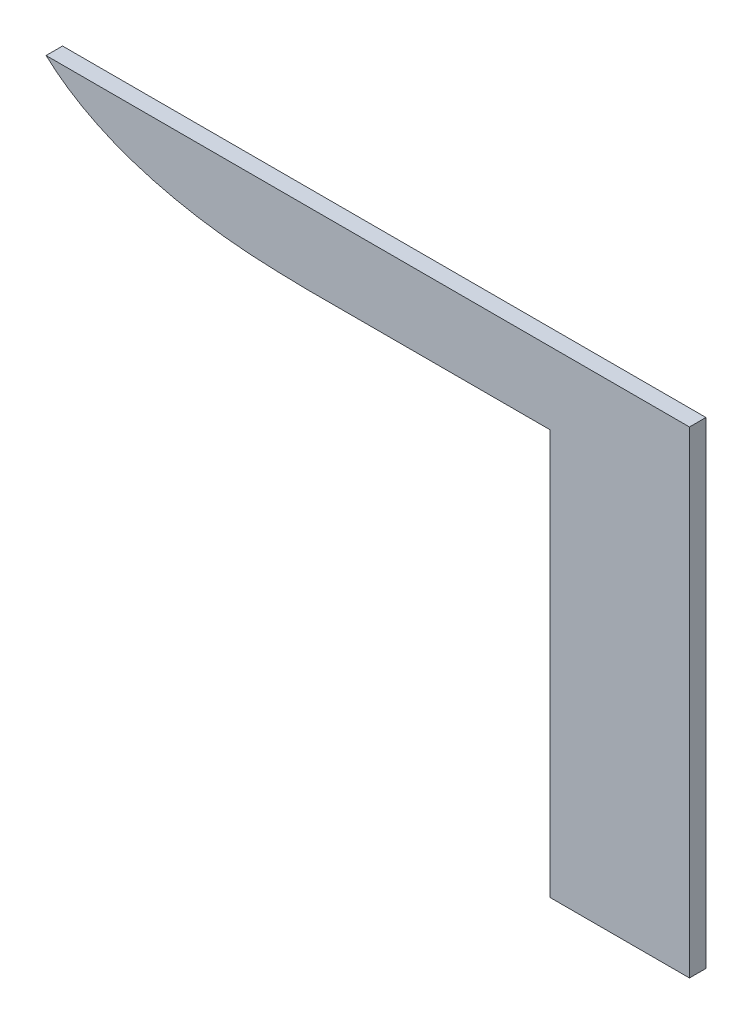
ISO-10303-21;
HEADER;
FILE_DESCRIPTION(('STEP AP214'),'2;1');
FILE_NAME('part.step','',(''),(''),'','','');
FILE_SCHEMA(('AUTOMOTIVE_DESIGN { 1 0 10303 214 1 1 1 1 }'));
ENDSEC;
DATA;
#1=APPLICATION_CONTEXT('core data for automotive mechanical design processes');
#2=APPLICATION_PROTOCOL_DEFINITION('international standard','automotive_design',2000,#1);
#3=PRODUCT_CONTEXT('',#1,'mechanical');
#4=PRODUCT('Part','Part','',(#3));
#5=PRODUCT_RELATED_PRODUCT_CATEGORY('part','',(#4));
#6=PRODUCT_DEFINITION_FORMATION('','',#4);
#7=PRODUCT_DEFINITION_CONTEXT('part definition',#1,'design');
#8=PRODUCT_DEFINITION('design','',#6,#7);
#9=PRODUCT_DEFINITION_SHAPE('','',#8);
#10=(LENGTH_UNIT() NAMED_UNIT(*) SI_UNIT(.MILLI.,.METRE.));
#11=(NAMED_UNIT(*) PLANE_ANGLE_UNIT() SI_UNIT($,.RADIAN.));
#12=(NAMED_UNIT(*) SI_UNIT($,.STERADIAN.) SOLID_ANGLE_UNIT());
#13=UNCERTAINTY_MEASURE_WITH_UNIT(LENGTH_MEASURE(1.E-05),#10,'distance_accuracy_value','');
#14=(GEOMETRIC_REPRESENTATION_CONTEXT(3) GLOBAL_UNCERTAINTY_ASSIGNED_CONTEXT((#13)) GLOBAL_UNIT_ASSIGNED_CONTEXT((#10,
#11,#12)) REPRESENTATION_CONTEXT('',''));
#15=CARTESIAN_POINT('',(0.,0.,0.));
#16=DIRECTION('',(0.,0.,1.));
#17=DIRECTION('',(1.,0.,0.));
#18=AXIS2_PLACEMENT_3D('',#15,#16,#17);
#19=CARTESIAN_POINT('',(6.15384615384617,-15.,0.5));
#20=DIRECTION('',(0.,1.,0.));
#21=DIRECTION('',(0.,0.,1.));
#22=AXIS2_PLACEMENT_3D('',#19,#20,#21);
#23=PLANE('',#22);
#24=DIRECTION('',(1.,0.,0.));
#25=VECTOR('',#24,1.);
#26=CARTESIAN_POINT('',(6.15384615384617,-15.,0.));
#27=LINE('',#26,#25);
#28=CARTESIAN_POINT('',(6.15384615384617,-15.,0.));
#29=VERTEX_POINT('',#28);
#30=CARTESIAN_POINT('',(10.3846153846154,-15.,0.));
#31=VERTEX_POINT('',#30);
#32=EDGE_CURVE('E95',#29,#31,#27,.T.);
#33=ORIENTED_EDGE('',*,*,#32,.T.);
#34=DIRECTION('',(0.,0.,-1.));
#35=VECTOR('',#34,1.);
#36=CARTESIAN_POINT('',(10.3846153846154,-15.,0.5));
#37=LINE('',#36,#35);
#38=CARTESIAN_POINT('',(10.3846153846154,-15.,0.5));
#39=VERTEX_POINT('',#38);
#40=EDGE_CURVE('E48',#39,#31,#37,.T.);
#41=ORIENTED_EDGE('',*,*,#40,.F.);
#42=DIRECTION('',(1.,0.,0.));
#43=VECTOR('',#42,1.);
#44=CARTESIAN_POINT('',(6.15384615384617,-15.,0.5));
#45=LINE('',#44,#43);
#46=CARTESIAN_POINT('',(6.15384615384617,-15.,0.5));
#47=VERTEX_POINT('',#46);
#48=EDGE_CURVE('E131',#47,#39,#45,.T.);
#49=ORIENTED_EDGE('',*,*,#48,.F.);
#50=DIRECTION('',(0.,0.,-1.));
#51=VECTOR('',#50,1.);
#52=CARTESIAN_POINT('',(6.15384615384617,-15.,0.5));
#53=LINE('',#52,#51);
#54=EDGE_CURVE('E130',#47,#29,#53,.T.);
#55=ORIENTED_EDGE('',*,*,#54,.T.);
#56=EDGE_LOOP('',(#33,#41,#49,#55));
#57=FACE_BOUND('',#56,.T.);
#58=ADVANCED_FACE('F39',(#57),#23,.F.);
#59=CARTESIAN_POINT('',(6.15384615384617,-2.69230769230769,0.5));
#60=DIRECTION('',(1.,0.,0.));
#61=DIRECTION('',(0.,0.,-1.));
#62=AXIS2_PLACEMENT_3D('',#59,#60,#61);
#63=PLANE('',#62);
#64=DIRECTION('',(0.,-1.,0.));
#65=VECTOR('',#64,1.);
#66=CARTESIAN_POINT('',(6.15384615384617,-2.69230769230769,0.));
#67=LINE('',#66,#65);
#68=CARTESIAN_POINT('',(6.15384615384617,-2.69230769230769,0.));
#69=VERTEX_POINT('',#68);
#70=EDGE_CURVE('E127',#69,#29,#67,.T.);
#71=ORIENTED_EDGE('',*,*,#70,.T.);
#72=ORIENTED_EDGE('',*,*,#54,.F.);
#73=DIRECTION('',(0.,-1.,0.));
#74=VECTOR('',#73,1.);
#75=CARTESIAN_POINT('',(6.15384615384617,-2.69230769230769,0.5));
#76=LINE('',#75,#74);
#77=CARTESIAN_POINT('',(6.15384615384617,-2.69230769230769,0.5));
#78=VERTEX_POINT('',#77);
#79=EDGE_CURVE('E129',#78,#47,#76,.T.);
#80=ORIENTED_EDGE('',*,*,#79,.F.);
#81=DIRECTION('',(0.,0.,-1.));
#82=VECTOR('',#81,1.);
#83=CARTESIAN_POINT('',(6.15384615384617,-2.69230769230769,0.5));
#84=LINE('',#83,#82);
#85=EDGE_CURVE('E125',#78,#69,#84,.T.);
#86=ORIENTED_EDGE('',*,*,#85,.T.);
#87=EDGE_LOOP('',(#71,#72,#80,#86));
#88=FACE_BOUND('',#87,.T.);
#89=ADVANCED_FACE('F143',(#88),#63,.F.);
#90=CARTESIAN_POINT('',(-1.19591346153845,-2.69230769230769,0.5));
#91=DIRECTION('',(0.,1.,0.));
#92=DIRECTION('',(0.,0.,1.));
#93=AXIS2_PLACEMENT_3D('',#90,#91,#92);
#94=PLANE('',#93);
#95=DIRECTION('',(1.,0.,0.));
#96=VECTOR('',#95,1.);
#97=CARTESIAN_POINT('',(-1.19591346153845,-2.69230769230769,0.));
#98=LINE('',#97,#96);
#99=CARTESIAN_POINT('',(-1.19591346153845,-2.69230769230769,0.));
#100=VERTEX_POINT('',#99);
#101=EDGE_CURVE('E107',#100,#69,#98,.T.);
#102=ORIENTED_EDGE('',*,*,#101,.T.);
#103=ORIENTED_EDGE('',*,*,#85,.F.);
#104=DIRECTION('',(1.,0.,0.));
#105=VECTOR('',#104,1.);
#106=CARTESIAN_POINT('',(-1.19591346153845,-2.69230769230769,0.5));
#107=LINE('',#106,#105);
#108=CARTESIAN_POINT('',(-1.19591346153845,-2.69230769230769,0.5));
#109=VERTEX_POINT('',#108);
#110=EDGE_CURVE('E146',#109,#78,#107,.T.);
#111=ORIENTED_EDGE('',*,*,#110,.F.);
#112=DIRECTION('',(0.,0.,-1.));
#113=VECTOR('',#112,1.);
#114=CARTESIAN_POINT('',(-1.19591346153845,-2.69230769230769,0.5));
#115=LINE('',#114,#113);
#116=EDGE_CURVE('E123',#109,#100,#115,.T.);
#117=ORIENTED_EDGE('',*,*,#116,.T.);
#118=EDGE_LOOP('',(#102,#103,#111,#117));
#119=FACE_BOUND('',#118,.T.);
#120=ADVANCED_FACE('F139',(#119),#94,.F.);
#121=CARTESIAN_POINT('',(-2.86670923646913,14.9469507429344,0.5));
#122=DIRECTION('',(0.,0.,-1.));
#123=DIRECTION('',(-1.,0.,0.));
#124=AXIS2_PLACEMENT_3D('',#121,#122,#123);
#125=PLANE('',#124);
#126=DIRECTION('',(0.,1.,0.));
#127=VECTOR('',#126,1.);
#128=CARTESIAN_POINT('',(10.3846153846154,-15.,0.5));
#129=LINE('',#128,#127);
#130=CARTESIAN_POINT('',(10.3846153846154,-0.5,0.5));
#131=VERTEX_POINT('',#130);
#132=EDGE_CURVE('E136',#39,#131,#129,.T.);
#133=ORIENTED_EDGE('',*,*,#132,.T.);
#134=DIRECTION('',(-1.,0.,0.));
#135=VECTOR('',#134,1.);
#136=CARTESIAN_POINT('',(-2.86670923646913,-0.5,0.5));
#137=LINE('',#136,#135);
#138=CARTESIAN_POINT('',(-9.16442769140376,-0.500000000014972,0.5));
#139=VERTEX_POINT('',#138);
#140=EDGE_CURVE('E88',#131,#139,#137,.T.);
#141=ORIENTED_EDGE('',*,*,#140,.T.);
#142=CARTESIAN_POINT('',(-11.9230769230769,6.37620192307692,0.5));
#143=CARTESIAN_POINT('',(-11.9164523883656,6.06536319775668,0.5));
#144=CARTESIAN_POINT('',(-11.9034182534223,5.45377097762736,0.5));
#145=CARTESIAN_POINT('',(-11.7914962037805,4.55525374172224,0.5));
#146=CARTESIAN_POINT('',(-11.6149709347498,3.69084362808375,0.5));
#147=CARTESIAN_POINT('',(-11.3516595574946,2.86645592929951,0.5));
#148=CARTESIAN_POINT('',(-11.0297543254307,2.07245274326711,0.5));
#149=CARTESIAN_POINT('',(-10.624079350204,1.32222512292036,0.5));
#150=CARTESIAN_POINT('',(-10.1503654357704,0.605585610203963,0.5));
#151=CARTESIAN_POINT('',(-9.60686856623352,-0.0755157562340138,0.5));
#152=CARTESIAN_POINT('',(-8.96702180481229,-0.707257877884189,0.5));
#153=CARTESIAN_POINT('',(-8.19720749218899,-1.24316686773636,0.5));
#154=CARTESIAN_POINT('',(-7.3122677220458,-1.69317977262245,0.5));
#155=CARTESIAN_POINT('',(-6.31199609916221,-2.05678533275972,0.5));
#156=CARTESIAN_POINT('',(-5.19882080470571,-2.34288431635212,0.5));
#157=CARTESIAN_POINT('',(-3.96909448292088,-2.55250497248433,0.5));
#158=CARTESIAN_POINT('',(-2.62042159325954,-2.66823301951604,0.5));
#159=CARTESIAN_POINT('',(-1.68290914412343,-2.68407729934039,0.5));
#160=CARTESIAN_POINT('',(-1.19591346153845,-2.69230769230769,0.5));
#161=B_SPLINE_CURVE_WITH_KNOTS('',3,(#142,#143,#144,#145,#146,#147,#148,#149,#150,#151,#152,
#153,#154,#155,#156,#157,#158,#159,#160),.UNSPECIFIED.,.F.,.F.,(4,1,1,1,1,1,1,1,1,1,1,1,1,1,1,1,
4),(0.,0.0580480686591468,0.114212755019154,0.168891647175276,0.222626270124239,
0.275651229891811,0.328725027145903,0.381658791237261,0.43595343503421,0.491263855848966,
0.548992591180569,0.610416548658029,0.676247964980973,0.747409474018392,0.824866485744554,
0.909025991711439,1.),.UNSPECIFIED.);
#162=EDGE_CURVE('E148',#139,#109,#161,.T.);
#163=ORIENTED_EDGE('',*,*,#162,.T.);
#164=ORIENTED_EDGE('',*,*,#110,.T.);
#165=ORIENTED_EDGE('',*,*,#79,.T.);
#166=ORIENTED_EDGE('',*,*,#48,.T.);
#167=EDGE_LOOP('',(#133,#141,#163,#164,#165,#166));
#168=FACE_BOUND('',#167,.T.);
#169=ADVANCED_FACE('F149',(#168),#125,.F.);
#170=DIRECTION('',(0.,0.,-1.));
#171=VECTOR('',#170,1.);
#172=SURFACE_OF_LINEAR_EXTRUSION('',#161,#171);
#173=ORIENTED_EDGE('',*,*,#162,.F.);
#174=DIRECTION('',(0.,0.,-1.));
#175=VECTOR('',#174,1.);
#176=CARTESIAN_POINT('',(-9.16442769142002,-0.5,0.5));
#177=LINE('',#176,#175);
#178=CARTESIAN_POINT('',(-9.16432715507257,-0.5,-1.2E-05));
#179=VERTEX_POINT('',#178);
#180=EDGE_CURVE('E53',#139,#179,#177,.T.);
#181=ORIENTED_EDGE('',*,*,#180,.T.);
#182=CARTESIAN_POINT('',(-11.9230769230769,6.37620192307692,0.));
#183=CARTESIAN_POINT('',(-11.9164523883656,6.06536319775668,0.));
#184=CARTESIAN_POINT('',(-11.9034182534223,5.45377097762736,0.));
#185=CARTESIAN_POINT('',(-11.7914962037805,4.55525374172224,0.));
#186=CARTESIAN_POINT('',(-11.6149709347498,3.69084362808375,0.));
#187=CARTESIAN_POINT('',(-11.3516595574946,2.86645592929951,0.));
#188=CARTESIAN_POINT('',(-11.0297543254307,2.07245274326711,0.));
#189=CARTESIAN_POINT('',(-10.624079350204,1.32222512292036,0.));
#190=CARTESIAN_POINT('',(-10.1503654357704,0.605585610203963,0.));
#191=CARTESIAN_POINT('',(-9.60686856623352,-0.0755157562340138,0.));
#192=CARTESIAN_POINT('',(-8.96702180481229,-0.707257877884189,0.));
#193=CARTESIAN_POINT('',(-8.19720749218899,-1.24316686773636,0.));
#194=CARTESIAN_POINT('',(-7.3122677220458,-1.69317977262245,0.));
#195=CARTESIAN_POINT('',(-6.31199609916221,-2.05678533275972,0.));
#196=CARTESIAN_POINT('',(-5.19882080470571,-2.34288431635212,0.));
#197=CARTESIAN_POINT('',(-3.96909448292088,-2.55250497248433,0.));
#198=CARTESIAN_POINT('',(-2.62042159325954,-2.66823301951604,0.));
#199=CARTESIAN_POINT('',(-1.68290914412343,-2.68407729934039,0.));
#200=CARTESIAN_POINT('',(-1.19591346153845,-2.69230769230769,0.));
#201=B_SPLINE_CURVE_WITH_KNOTS('',3,(#182,#183,#184,#185,#186,#187,#188,#189,#190,#191,#192,
#193,#194,#195,#196,#197,#198,#199,#200),.UNSPECIFIED.,.F.,.F.,(4,1,1,1,1,1,1,1,1,1,1,1,1,1,1,1,
4),(0.,0.0580480686591468,0.114212755019154,0.168891647175276,0.222626270124239,
0.275651229891811,0.328725027145903,0.381658791237261,0.43595343503421,0.491263855848966,
0.548992591180569,0.610416548658029,0.676247964980973,0.747409474018392,0.824866485744554,
0.909025991711439,1.),.UNSPECIFIED.);
#202=EDGE_CURVE('E102',#179,#100,#201,.T.);
#203=ORIENTED_EDGE('',*,*,#202,.T.);
#204=ORIENTED_EDGE('',*,*,#116,.F.);
#205=EDGE_LOOP('',(#173,#181,#203,#204));
#206=FACE_BOUND('',#205,.T.);
#207=ADVANCED_FACE('F162',(#206),#172,.F.);
#208=CARTESIAN_POINT('',(10.3846153846154,-15.,0.5));
#209=DIRECTION('',(-1.,0.,0.));
#210=DIRECTION('',(0.,0.,1.));
#211=AXIS2_PLACEMENT_3D('',#208,#209,#210);
#212=PLANE('',#211);
#213=DIRECTION('',(0.,1.,0.));
#214=VECTOR('',#213,1.);
#215=CARTESIAN_POINT('',(10.3846153846154,-15.,0.));
#216=LINE('',#215,#214);
#217=CARTESIAN_POINT('',(10.3846153846154,-0.5,0.));
#218=VERTEX_POINT('',#217);
#219=EDGE_CURVE('E97',#31,#218,#216,.T.);
#220=ORIENTED_EDGE('',*,*,#219,.T.);
#221=DIRECTION('',(0.,0.,1.));
#222=VECTOR('',#221,1.);
#223=CARTESIAN_POINT('',(10.3846153846154,-0.5,0.5));
#224=LINE('',#223,#222);
#225=EDGE_CURVE('E86',#218,#131,#224,.T.);
#226=ORIENTED_EDGE('',*,*,#225,.T.);
#227=ORIENTED_EDGE('',*,*,#132,.F.);
#228=ORIENTED_EDGE('',*,*,#40,.T.);
#229=EDGE_LOOP('',(#220,#226,#227,#228));
#230=FACE_BOUND('',#229,.T.);
#231=ADVANCED_FACE('F105',(#230),#212,.F.);
#232=CARTESIAN_POINT('',(-2.86670923646913,14.9469507429344,0.));
#233=DIRECTION('',(0.,0.,-1.));
#234=DIRECTION('',(-1.,0.,0.));
#235=AXIS2_PLACEMENT_3D('',#232,#233,#234);
#236=PLANE('',#235);
#237=DIRECTION('',(-1.,0.,0.));
#238=VECTOR('',#237,1.);
#239=CARTESIAN_POINT('',(-2.86670923646913,-0.5,0.));
#240=LINE('',#239,#238);
#241=EDGE_CURVE('E11',#218,#179,#240,.T.);
#242=ORIENTED_EDGE('',*,*,#241,.F.);
#243=ORIENTED_EDGE('',*,*,#219,.F.);
#244=ORIENTED_EDGE('',*,*,#32,.F.);
#245=ORIENTED_EDGE('',*,*,#70,.F.);
#246=ORIENTED_EDGE('',*,*,#101,.F.);
#247=ORIENTED_EDGE('',*,*,#202,.F.);
#248=EDGE_LOOP('',(#242,#243,#244,#245,#246,#247));
#249=FACE_BOUND('',#248,.T.);
#250=ADVANCED_FACE('F96',(#249),#236,.T.);
#251=CARTESIAN_POINT('',(-17.,-0.5,1.));
#252=DIRECTION('',(0.,-1.,0.));
#253=DIRECTION('',(0.,0.,-1.));
#254=AXIS2_PLACEMENT_3D('',#251,#252,#253);
#255=PLANE('',#254);
#256=ORIENTED_EDGE('',*,*,#241,.T.);
#257=ORIENTED_EDGE('',*,*,#180,.F.);
#258=ORIENTED_EDGE('',*,*,#140,.F.);
#259=ORIENTED_EDGE('',*,*,#225,.F.);
#260=EDGE_LOOP('',(#256,#257,#258,#259));
#261=FACE_BOUND('',#260,.T.);
#262=ADVANCED_FACE('F90',(#261),#255,.F.);
#263=CLOSED_SHELL('',(#58,#89,#120,#169,#207,#231,#250,#262));
#264=MANIFOLD_SOLID_BREP('B2',#263);
#265=ADVANCED_BREP_SHAPE_REPRESENTATION('',(#18,#264),#14);
#266=SHAPE_DEFINITION_REPRESENTATION(#9,#265);
ENDSEC;
END-ISO-10303-21;
